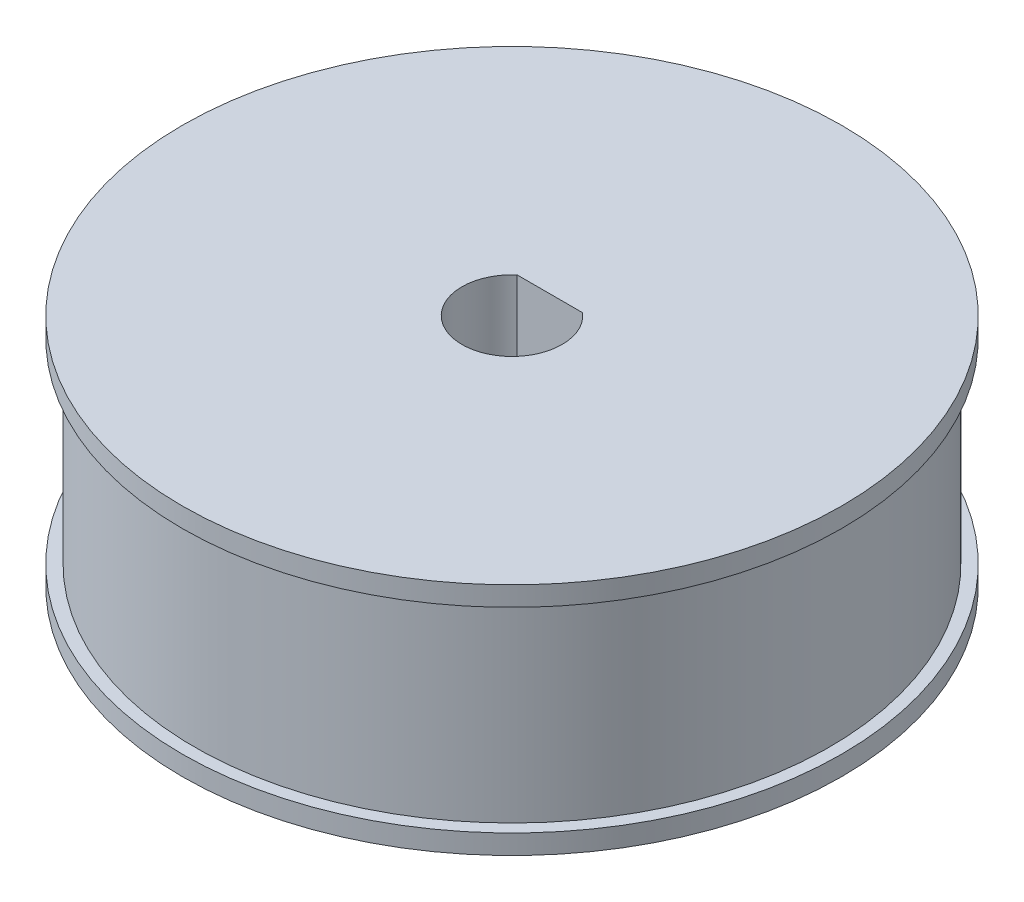
ISO-10303-21;
HEADER;
FILE_DESCRIPTION(('STEP AP214'),'2;1');
FILE_NAME('part.step','',(''),(''),'','','');
FILE_SCHEMA(('AUTOMOTIVE_DESIGN { 1 0 10303 214 1 1 1 1 }'));
ENDSEC;
DATA;
#1=APPLICATION_CONTEXT('core data for automotive mechanical design processes');
#2=APPLICATION_PROTOCOL_DEFINITION('international standard','automotive_design',2000,#1);
#3=PRODUCT_CONTEXT('',#1,'mechanical');
#4=PRODUCT('Part','Part','',(#3));
#5=PRODUCT_RELATED_PRODUCT_CATEGORY('part','',(#4));
#6=PRODUCT_DEFINITION_FORMATION('','',#4);
#7=PRODUCT_DEFINITION_CONTEXT('part definition',#1,'design');
#8=PRODUCT_DEFINITION('design','',#6,#7);
#9=PRODUCT_DEFINITION_SHAPE('','',#8);
#10=(LENGTH_UNIT() NAMED_UNIT(*) SI_UNIT(.MILLI.,.METRE.));
#11=(NAMED_UNIT(*) PLANE_ANGLE_UNIT() SI_UNIT($,.RADIAN.));
#12=(NAMED_UNIT(*) SI_UNIT($,.STERADIAN.) SOLID_ANGLE_UNIT());
#13=UNCERTAINTY_MEASURE_WITH_UNIT(LENGTH_MEASURE(1.E-05),#10,'distance_accuracy_value','');
#14=(GEOMETRIC_REPRESENTATION_CONTEXT(3) GLOBAL_UNCERTAINTY_ASSIGNED_CONTEXT((#13)) GLOBAL_UNIT_ASSIGNED_CONTEXT((#10,
#11,#12)) REPRESENTATION_CONTEXT('',''));
#15=CARTESIAN_POINT('',(0.,0.,0.));
#16=DIRECTION('',(0.,0.,1.));
#17=DIRECTION('',(1.,0.,0.));
#18=AXIS2_PLACEMENT_3D('',#15,#16,#17);
#19=CARTESIAN_POINT('',(2.,0.,0.));
#20=DIRECTION('',(0.,-1.,0.));
#21=DIRECTION('',(0.,0.,-1.));
#22=AXIS2_PLACEMENT_3D('',#19,#20,#21);
#23=PLANE('',#22);
#24=CARTESIAN_POINT('',(0.,0.,0.));
#25=DIRECTION('',(0.,-1.,0.));
#26=DIRECTION('',(0.,0.,-1.));
#27=AXIS2_PLACEMENT_3D('',#24,#25,#26);
#28=CIRCLE('',#27,2.05);
#29=CARTESIAN_POINT('',(1.34164078649987,0.,-1.55));
#30=VERTEX_POINT('',#29);
#31=CARTESIAN_POINT('',(-1.34164078649987,0.,-1.55));
#32=VERTEX_POINT('',#31);
#33=EDGE_CURVE('E42',#30,#32,#28,.T.);
#34=ORIENTED_EDGE('',*,*,#33,.F.);
#35=DIRECTION('',(-1.,0.,0.));
#36=VECTOR('',#35,1.);
#37=CARTESIAN_POINT('',(-1.34164078649987,0.,-1.55));
#38=LINE('',#37,#36);
#39=EDGE_CURVE('E82',#32,#30,#38,.F.);
#40=ORIENTED_EDGE('',*,*,#39,.F.);
#41=EDGE_LOOP('',(#34,#40));
#42=FACE_BOUND('',#41,.T.);
#43=CARTESIAN_POINT('',(0.,0.,0.));
#44=DIRECTION('',(0.,-1.,0.));
#45=DIRECTION('',(0.,0.,-1.));
#46=AXIS2_PLACEMENT_3D('',#43,#44,#45);
#47=CIRCLE('',#46,13.5);
#48=CARTESIAN_POINT('',(0.,0.,-13.5));
#49=VERTEX_POINT('',#48);
#50=EDGE_CURVE('E11',#49,#49,#47,.T.);
#51=ORIENTED_EDGE('',*,*,#50,.T.);
#52=EDGE_LOOP('',(#51));
#53=FACE_BOUND('',#52,.T.);
#54=ADVANCED_FACE('F39',(#42,#53),#23,.T.);
#55=CARTESIAN_POINT('',(0.,0.,0.));
#56=DIRECTION('',(0.,-1.,0.));
#57=DIRECTION('',(0.,0.,-1.));
#58=AXIS2_PLACEMENT_3D('',#55,#56,#57);
#59=CYLINDRICAL_SURFACE('',#58,13.5);
#60=CARTESIAN_POINT('',(0.,0.8,0.));
#61=DIRECTION('',(0.,-1.,0.));
#62=DIRECTION('',(0.,0.,-1.));
#63=AXIS2_PLACEMENT_3D('',#60,#61,#62);
#64=CIRCLE('',#63,13.5);
#65=CARTESIAN_POINT('',(0.,0.8,-13.5));
#66=VERTEX_POINT('',#65);
#67=EDGE_CURVE('E47',#66,#66,#64,.T.);
#68=ORIENTED_EDGE('',*,*,#67,.T.);
#69=EDGE_LOOP('',(#68));
#70=FACE_BOUND('',#69,.T.);
#71=ORIENTED_EDGE('',*,*,#50,.F.);
#72=EDGE_LOOP('',(#71));
#73=FACE_BOUND('',#72,.T.);
#74=ADVANCED_FACE('F99',(#70,#73),#59,.T.);
#75=CARTESIAN_POINT('',(13.5,0.800000000000001,0.));
#76=DIRECTION('',(0.,1.,0.));
#77=DIRECTION('',(0.,0.,1.));
#78=AXIS2_PLACEMENT_3D('',#75,#76,#77);
#79=PLANE('',#78);
#80=CARTESIAN_POINT('',(0.,0.800000000000001,0.));
#81=DIRECTION('',(0.,-1.,0.));
#82=DIRECTION('',(0.,0.,-1.));
#83=AXIS2_PLACEMENT_3D('',#80,#81,#82);
#84=CIRCLE('',#83,13.);
#85=CARTESIAN_POINT('',(0.,0.800000000000001,-13.));
#86=VERTEX_POINT('',#85);
#87=EDGE_CURVE('E92',#86,#86,#84,.T.);
#88=ORIENTED_EDGE('',*,*,#87,.T.);
#89=EDGE_LOOP('',(#88));
#90=FACE_BOUND('',#89,.T.);
#91=ORIENTED_EDGE('',*,*,#67,.F.);
#92=EDGE_LOOP('',(#91));
#93=FACE_BOUND('',#92,.T.);
#94=ADVANCED_FACE('F103',(#90,#93),#79,.T.);
#95=CARTESIAN_POINT('',(0.,0.,0.));
#96=DIRECTION('',(0.,-1.,0.));
#97=DIRECTION('',(0.,0.,-1.));
#98=AXIS2_PLACEMENT_3D('',#95,#96,#97);
#99=CYLINDRICAL_SURFACE('',#98,13.);
#100=CARTESIAN_POINT('',(0.,8.8,0.));
#101=DIRECTION('',(0.,-1.,0.));
#102=DIRECTION('',(0.,0.,-1.));
#103=AXIS2_PLACEMENT_3D('',#100,#101,#102);
#104=CIRCLE('',#103,13.);
#105=CARTESIAN_POINT('',(0.,8.8,-13.));
#106=VERTEX_POINT('',#105);
#107=EDGE_CURVE('E89',#106,#106,#104,.T.);
#108=ORIENTED_EDGE('',*,*,#107,.T.);
#109=EDGE_LOOP('',(#108));
#110=FACE_BOUND('',#109,.T.);
#111=ORIENTED_EDGE('',*,*,#87,.F.);
#112=EDGE_LOOP('',(#111));
#113=FACE_BOUND('',#112,.T.);
#114=ADVANCED_FACE('F108',(#110,#113),#99,.T.);
#115=CARTESIAN_POINT('',(13.,8.8,0.));
#116=DIRECTION('',(0.,-1.,0.));
#117=DIRECTION('',(0.,0.,-1.));
#118=AXIS2_PLACEMENT_3D('',#115,#116,#117);
#119=PLANE('',#118);
#120=CARTESIAN_POINT('',(0.,8.8,0.));
#121=DIRECTION('',(0.,-1.,0.));
#122=DIRECTION('',(0.,0.,-1.));
#123=AXIS2_PLACEMENT_3D('',#120,#121,#122);
#124=CIRCLE('',#123,13.5);
#125=CARTESIAN_POINT('',(0.,8.8,-13.5));
#126=VERTEX_POINT('',#125);
#127=EDGE_CURVE('E86',#126,#126,#124,.T.);
#128=ORIENTED_EDGE('',*,*,#127,.T.);
#129=EDGE_LOOP('',(#128));
#130=FACE_BOUND('',#129,.T.);
#131=ORIENTED_EDGE('',*,*,#107,.F.);
#132=EDGE_LOOP('',(#131));
#133=FACE_BOUND('',#132,.T.);
#134=ADVANCED_FACE('F114',(#130,#133),#119,.T.);
#135=CARTESIAN_POINT('',(0.,0.,0.));
#136=DIRECTION('',(0.,-1.,0.));
#137=DIRECTION('',(0.,0.,-1.));
#138=AXIS2_PLACEMENT_3D('',#135,#136,#137);
#139=CYLINDRICAL_SURFACE('',#138,13.5);
#140=CARTESIAN_POINT('',(0.,9.6,0.));
#141=DIRECTION('',(0.,-1.,0.));
#142=DIRECTION('',(0.,0.,-1.));
#143=AXIS2_PLACEMENT_3D('',#140,#141,#142);
#144=CIRCLE('',#143,13.5);
#145=CARTESIAN_POINT('',(0.,9.6,-13.5));
#146=VERTEX_POINT('',#145);
#147=EDGE_CURVE('E83',#146,#146,#144,.T.);
#148=ORIENTED_EDGE('',*,*,#147,.T.);
#149=EDGE_LOOP('',(#148));
#150=FACE_BOUND('',#149,.T.);
#151=ORIENTED_EDGE('',*,*,#127,.F.);
#152=EDGE_LOOP('',(#151));
#153=FACE_BOUND('',#152,.T.);
#154=ADVANCED_FACE('F118',(#150,#153),#139,.T.);
#155=CARTESIAN_POINT('',(13.5,9.6,0.));
#156=DIRECTION('',(0.,1.,0.));
#157=DIRECTION('',(0.,0.,1.));
#158=AXIS2_PLACEMENT_3D('',#155,#156,#157);
#159=PLANE('',#158);
#160=CARTESIAN_POINT('',(0.,9.6,0.));
#161=DIRECTION('',(0.,-1.,0.));
#162=DIRECTION('',(0.,0.,-1.));
#163=AXIS2_PLACEMENT_3D('',#160,#161,#162);
#164=CIRCLE('',#163,2.05);
#165=CARTESIAN_POINT('',(1.34164078649987,9.6,-1.55));
#166=VERTEX_POINT('',#165);
#167=CARTESIAN_POINT('',(-1.34164078649987,9.6,-1.55));
#168=VERTEX_POINT('',#167);
#169=EDGE_CURVE('E63',#166,#168,#164,.T.);
#170=ORIENTED_EDGE('',*,*,#169,.T.);
#171=DIRECTION('',(1.,0.,0.));
#172=VECTOR('',#171,1.);
#173=CARTESIAN_POINT('',(-1.34164078649987,9.6,-1.55));
#174=LINE('',#173,#172);
#175=EDGE_CURVE('E71',#168,#166,#174,.T.);
#176=ORIENTED_EDGE('',*,*,#175,.T.);
#177=EDGE_LOOP('',(#170,#176));
#178=FACE_BOUND('',#177,.T.);
#179=ORIENTED_EDGE('',*,*,#147,.F.);
#180=EDGE_LOOP('',(#179));
#181=FACE_BOUND('',#180,.T.);
#182=ADVANCED_FACE('F77',(#178,#181),#159,.T.);
#183=CARTESIAN_POINT('',(0.,9.6,0.));
#184=DIRECTION('',(0.,-1.,0.));
#185=DIRECTION('',(0.,0.,-1.));
#186=AXIS2_PLACEMENT_3D('',#183,#184,#185);
#187=CYLINDRICAL_SURFACE('',#186,2.05);
#188=ORIENTED_EDGE('',*,*,#33,.T.);
#189=DIRECTION('',(0.,-1.,0.));
#190=VECTOR('',#189,1.);
#191=CARTESIAN_POINT('',(-1.34164078649987,9.6,-1.55));
#192=LINE('',#191,#190);
#193=EDGE_CURVE('E55',#168,#32,#192,.T.);
#194=ORIENTED_EDGE('',*,*,#193,.F.);
#195=ORIENTED_EDGE('',*,*,#169,.F.);
#196=DIRECTION('',(0.,-1.,0.));
#197=VECTOR('',#196,1.);
#198=CARTESIAN_POINT('',(1.34164078649987,9.6,-1.55));
#199=LINE('',#198,#197);
#200=EDGE_CURVE('E70',#166,#30,#199,.T.);
#201=ORIENTED_EDGE('',*,*,#200,.T.);
#202=EDGE_LOOP('',(#188,#194,#195,#201));
#203=FACE_BOUND('',#202,.T.);
#204=ADVANCED_FACE('F67',(#203),#187,.F.);
#205=CARTESIAN_POINT('',(-1.34164078649987,9.6,-1.55));
#206=DIRECTION('',(0.,0.,-1.));
#207=DIRECTION('',(-1.,0.,0.));
#208=AXIS2_PLACEMENT_3D('',#205,#206,#207);
#209=PLANE('',#208);
#210=ORIENTED_EDGE('',*,*,#39,.T.);
#211=ORIENTED_EDGE('',*,*,#200,.F.);
#212=ORIENTED_EDGE('',*,*,#175,.F.);
#213=ORIENTED_EDGE('',*,*,#193,.T.);
#214=EDGE_LOOP('',(#210,#211,#212,#213));
#215=FACE_BOUND('',#214,.T.);
#216=ADVANCED_FACE('F74',(#215),#209,.F.);
#217=CLOSED_SHELL('',(#54,#74,#94,#114,#134,#154,#182,#204,#216));
#218=MANIFOLD_SOLID_BREP('B2',#217);
#219=ADVANCED_BREP_SHAPE_REPRESENTATION('',(#18,#218),#14);
#220=SHAPE_DEFINITION_REPRESENTATION(#9,#219);
ENDSEC;
END-ISO-10303-21;
